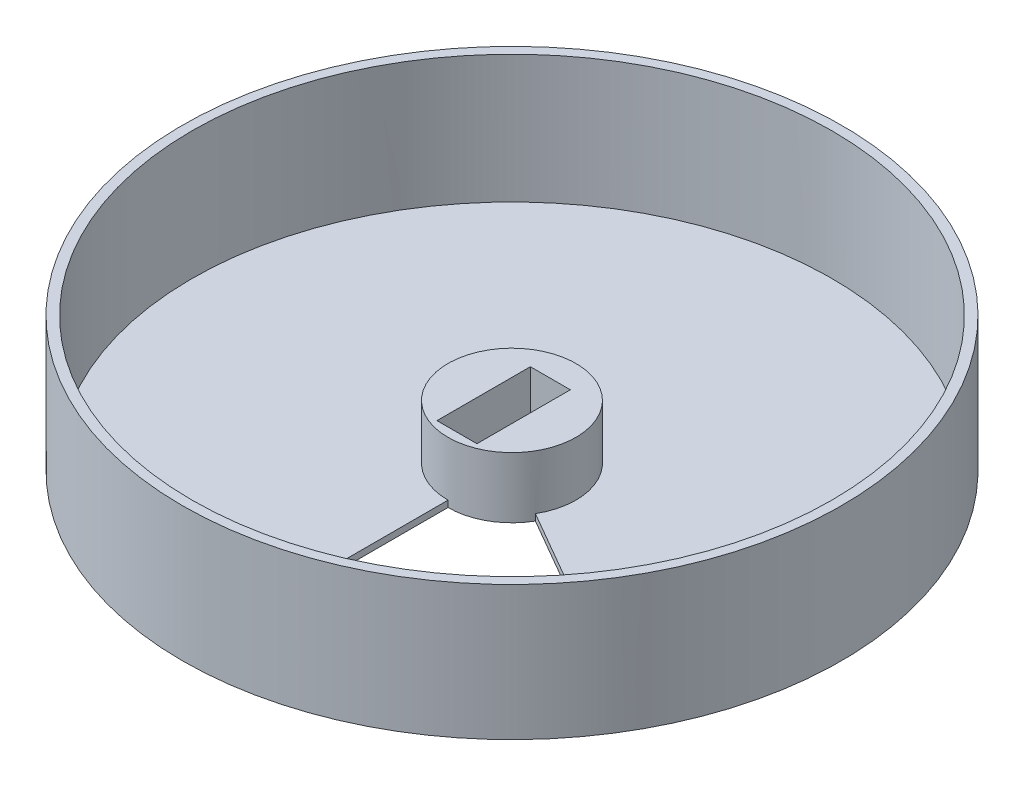
ISO-10303-21;
HEADER;
FILE_DESCRIPTION(('STEP AP214'),'2;1');
FILE_NAME('part.step','',(''),(''),'','','');
FILE_SCHEMA(('AUTOMOTIVE_DESIGN { 1 0 10303 214 1 1 1 1 }'));
ENDSEC;
DATA;
#1=APPLICATION_CONTEXT('core data for automotive mechanical design processes');
#2=APPLICATION_PROTOCOL_DEFINITION('international standard','automotive_design',2000,#1);
#3=PRODUCT_CONTEXT('',#1,'mechanical');
#4=PRODUCT('Part','Part','',(#3));
#5=PRODUCT_RELATED_PRODUCT_CATEGORY('part','',(#4));
#6=PRODUCT_DEFINITION_FORMATION('','',#4);
#7=PRODUCT_DEFINITION_CONTEXT('part definition',#1,'design');
#8=PRODUCT_DEFINITION('design','',#6,#7);
#9=PRODUCT_DEFINITION_SHAPE('','',#8);
#10=(LENGTH_UNIT() NAMED_UNIT(*) SI_UNIT(.MILLI.,.METRE.));
#11=(NAMED_UNIT(*) PLANE_ANGLE_UNIT() SI_UNIT($,.RADIAN.));
#12=(NAMED_UNIT(*) SI_UNIT($,.STERADIAN.) SOLID_ANGLE_UNIT());
#13=UNCERTAINTY_MEASURE_WITH_UNIT(LENGTH_MEASURE(1.E-05),#10,'distance_accuracy_value','');
#14=(GEOMETRIC_REPRESENTATION_CONTEXT(3) GLOBAL_UNCERTAINTY_ASSIGNED_CONTEXT((#13)) GLOBAL_UNIT_ASSIGNED_CONTEXT((#10,
#11,#12)) REPRESENTATION_CONTEXT('',''));
#15=CARTESIAN_POINT('',(0.,0.,0.));
#16=DIRECTION('',(0.,0.,1.));
#17=DIRECTION('',(1.,0.,0.));
#18=AXIS2_PLACEMENT_3D('',#15,#16,#17);
#19=CARTESIAN_POINT('',(6.25,0.,-17.2));
#20=DIRECTION('',(0.,-1.,0.));
#21=DIRECTION('',(0.,0.,-1.));
#22=AXIS2_PLACEMENT_3D('',#19,#20,#21);
#23=PLANE('',#22);
#24=DIRECTION('',(0.,0.,1.));
#25=VECTOR('',#24,1.);
#26=CARTESIAN_POINT('',(6.25,0.,0.));
#27=LINE('',#26,#25);
#28=CARTESIAN_POINT('',(6.25,0.,2.80000000000001));
#29=VERTEX_POINT('',#28);
#30=CARTESIAN_POINT('',(6.25,0.,82.8));
#31=VERTEX_POINT('',#30);
#32=EDGE_CURVE('E119',#29,#31,#27,.T.);
#33=ORIENTED_EDGE('',*,*,#32,.F.);
#34=CARTESIAN_POINT('',(6.25,0.,-17.2));
#35=DIRECTION('',(0.,1.,0.));
#36=DIRECTION('',(0.,0.,1.));
#37=AXIS2_PLACEMENT_3D('',#34,#35,#36);
#38=CIRCLE('',#37,20.);
#39=CARTESIAN_POINT('',(23.5705080756892,0.,-7.20000000000065));
#40=VERTEX_POINT('',#39);
#41=EDGE_CURVE('E131',#40,#29,#38,.T.);
#42=ORIENTED_EDGE('',*,*,#41,.F.);
#43=DIRECTION('',(0.866025403784439,0.,0.5));
#44=VECTOR('',#43,1.);
#45=CARTESIAN_POINT('',(9.01031847254655,0.,-15.606329386827));
#46=LINE('',#45,#44);
#47=CARTESIAN_POINT('',(92.8525403784443,0.,32.7999999999994));
#48=VERTEX_POINT('',#47);
#49=EDGE_CURVE('E127',#40,#48,#46,.T.);
#50=ORIENTED_EDGE('',*,*,#49,.T.);
#51=CARTESIAN_POINT('',(6.25,0.,-17.2));
#52=DIRECTION('',(0.,1.,0.));
#53=DIRECTION('',(0.,0.,1.));
#54=AXIS2_PLACEMENT_3D('',#51,#52,#53);
#55=CIRCLE('',#54,100.);
#56=EDGE_CURVE('E133',#48,#31,#55,.T.);
#57=ORIENTED_EDGE('',*,*,#56,.T.);
#58=EDGE_LOOP('',(#33,#42,#50,#57));
#59=FACE_BOUND('',#58,.T.);
#60=ADVANCED_FACE('F52',(#59),#23,.F.);
#61=CARTESIAN_POINT('',(12.5,17.,0.));
#62=DIRECTION('',(-1.,0.,0.));
#63=DIRECTION('',(0.,0.,1.));
#64=AXIS2_PLACEMENT_3D('',#61,#62,#63);
#65=PLANE('',#64);
#66=DIRECTION('',(0.,0.,-1.));
#67=VECTOR('',#66,1.);
#68=CARTESIAN_POINT('',(12.5,0.,0.));
#69=LINE('',#68,#67);
#70=CARTESIAN_POINT('',(12.5,0.,0.));
#71=VERTEX_POINT('',#70);
#72=CARTESIAN_POINT('',(12.5,0.,-29.2));
#73=VERTEX_POINT('',#72);
#74=EDGE_CURVE('E140',#71,#73,#69,.T.);
#75=ORIENTED_EDGE('',*,*,#74,.F.);
#76=DIRECTION('',(0.,-1.,0.));
#77=VECTOR('',#76,1.);
#78=CARTESIAN_POINT('',(12.5,17.,0.));
#79=LINE('',#78,#77);
#80=CARTESIAN_POINT('',(12.5,17.,0.));
#81=VERTEX_POINT('',#80);
#82=EDGE_CURVE('E166',#81,#71,#79,.T.);
#83=ORIENTED_EDGE('',*,*,#82,.F.);
#84=DIRECTION('',(0.,0.,-1.));
#85=VECTOR('',#84,1.);
#86=CARTESIAN_POINT('',(12.5,17.,0.));
#87=LINE('',#86,#85);
#88=CARTESIAN_POINT('',(12.5,17.,-29.2));
#89=VERTEX_POINT('',#88);
#90=EDGE_CURVE('E200',#81,#89,#87,.T.);
#91=ORIENTED_EDGE('',*,*,#90,.T.);
#92=DIRECTION('',(0.,-1.,0.));
#93=VECTOR('',#92,1.);
#94=CARTESIAN_POINT('',(12.5,17.,-29.2));
#95=LINE('',#94,#93);
#96=EDGE_CURVE('E155',#89,#73,#95,.T.);
#97=ORIENTED_EDGE('',*,*,#96,.T.);
#98=EDGE_LOOP('',(#75,#83,#91,#97));
#99=FACE_BOUND('',#98,.T.);
#100=ADVANCED_FACE('F54',(#99),#65,.T.);
#101=CARTESIAN_POINT('',(0.,17.,0.));
#102=DIRECTION('',(0.,0.,-1.));
#103=DIRECTION('',(-1.,0.,0.));
#104=AXIS2_PLACEMENT_3D('',#101,#102,#103);
#105=PLANE('',#104);
#106=DIRECTION('',(1.,0.,0.));
#107=VECTOR('',#106,1.);
#108=CARTESIAN_POINT('',(0.,0.,0.));
#109=LINE('',#108,#107);
#110=CARTESIAN_POINT('',(0.,0.,0.));
#111=VERTEX_POINT('',#110);
#112=EDGE_CURVE('E146',#111,#71,#109,.T.);
#113=ORIENTED_EDGE('',*,*,#112,.F.);
#114=DIRECTION('',(0.,-1.,0.));
#115=VECTOR('',#114,1.);
#116=CARTESIAN_POINT('',(0.,17.,0.));
#117=LINE('',#116,#115);
#118=CARTESIAN_POINT('',(0.,17.,0.));
#119=VERTEX_POINT('',#118);
#120=EDGE_CURVE('E163',#119,#111,#117,.T.);
#121=ORIENTED_EDGE('',*,*,#120,.F.);
#122=DIRECTION('',(1.,0.,0.));
#123=VECTOR('',#122,1.);
#124=CARTESIAN_POINT('',(0.,17.,0.));
#125=LINE('',#124,#123);
#126=EDGE_CURVE('E204',#119,#81,#125,.T.);
#127=ORIENTED_EDGE('',*,*,#126,.T.);
#128=ORIENTED_EDGE('',*,*,#82,.T.);
#129=EDGE_LOOP('',(#113,#121,#127,#128));
#130=FACE_BOUND('',#129,.T.);
#131=ADVANCED_FACE('F237',(#130),#105,.T.);
#132=CARTESIAN_POINT('',(0.,17.,0.));
#133=DIRECTION('',(-1.,0.,0.));
#134=DIRECTION('',(0.,0.,1.));
#135=AXIS2_PLACEMENT_3D('',#132,#133,#134);
#136=PLANE('',#135);
#137=DIRECTION('',(0.,0.,-1.));
#138=VECTOR('',#137,1.);
#139=CARTESIAN_POINT('',(0.,0.,0.));
#140=LINE('',#139,#138);
#141=CARTESIAN_POINT('',(0.,0.,-29.2));
#142=VERTEX_POINT('',#141);
#143=EDGE_CURVE('E219',#111,#142,#140,.T.);
#144=ORIENTED_EDGE('',*,*,#143,.T.);
#145=DIRECTION('',(0.,-1.,0.));
#146=VECTOR('',#145,1.);
#147=CARTESIAN_POINT('',(0.,17.,-29.2));
#148=LINE('',#147,#146);
#149=CARTESIAN_POINT('',(0.,17.,-29.2));
#150=VERTEX_POINT('',#149);
#151=EDGE_CURVE('E158',#150,#142,#148,.T.);
#152=ORIENTED_EDGE('',*,*,#151,.F.);
#153=DIRECTION('',(0.,0.,-1.));
#154=VECTOR('',#153,1.);
#155=CARTESIAN_POINT('',(0.,17.,0.));
#156=LINE('',#155,#154);
#157=EDGE_CURVE('E208',#119,#150,#156,.T.);
#158=ORIENTED_EDGE('',*,*,#157,.F.);
#159=ORIENTED_EDGE('',*,*,#120,.T.);
#160=EDGE_LOOP('',(#144,#152,#158,#159));
#161=FACE_BOUND('',#160,.T.);
#162=ADVANCED_FACE('F243',(#161),#136,.F.);
#163=CARTESIAN_POINT('',(0.,17.,-29.2));
#164=DIRECTION('',(0.,0.,-1.));
#165=DIRECTION('',(-1.,0.,0.));
#166=AXIS2_PLACEMENT_3D('',#163,#164,#165);
#167=PLANE('',#166);
#168=DIRECTION('',(1.,0.,0.));
#169=VECTOR('',#168,1.);
#170=CARTESIAN_POINT('',(0.,0.,-29.2));
#171=LINE('',#170,#169);
#172=EDGE_CURVE('E153',#142,#73,#171,.T.);
#173=ORIENTED_EDGE('',*,*,#172,.T.);
#174=ORIENTED_EDGE('',*,*,#96,.F.);
#175=DIRECTION('',(1.,0.,0.));
#176=VECTOR('',#175,1.);
#177=CARTESIAN_POINT('',(0.,17.,-29.2));
#178=LINE('',#177,#176);
#179=EDGE_CURVE('E211',#150,#89,#178,.T.);
#180=ORIENTED_EDGE('',*,*,#179,.F.);
#181=ORIENTED_EDGE('',*,*,#151,.T.);
#182=EDGE_LOOP('',(#173,#174,#180,#181));
#183=FACE_BOUND('',#182,.T.);
#184=ADVANCED_FACE('F229',(#183),#167,.F.);
#185=CARTESIAN_POINT('',(6.25,17.,-17.2));
#186=DIRECTION('',(0.,-1.,0.));
#187=DIRECTION('',(0.,0.,-1.));
#188=AXIS2_PLACEMENT_3D('',#185,#186,#187);
#189=CYLINDRICAL_SURFACE('',#188,20.);
#190=CARTESIAN_POINT('',(6.25,17.,-17.2));
#191=DIRECTION('',(0.,1.,0.));
#192=DIRECTION('',(0.,0.,1.));
#193=AXIS2_PLACEMENT_3D('',#190,#191,#192);
#194=CIRCLE('',#193,20.);
#195=CARTESIAN_POINT('',(6.25,17.,2.80000000000001));
#196=VERTEX_POINT('',#195);
#197=EDGE_CURVE('E159',#196,#196,#194,.T.);
#198=ORIENTED_EDGE('',*,*,#197,.F.);
#199=EDGE_LOOP('',(#198));
#200=FACE_BOUND('',#199,.T.);
#201=ORIENTED_EDGE('',*,*,#41,.T.);
#202=DIRECTION('',(0.,1.,0.));
#203=VECTOR('',#202,1.);
#204=CARTESIAN_POINT('',(6.25,-20.,2.80000000000001));
#205=LINE('',#204,#203);
#206=CARTESIAN_POINT('',(6.25,-2.,2.80000000000001));
#207=VERTEX_POINT('',#206);
#208=EDGE_CURVE('E116',#207,#29,#205,.T.);
#209=ORIENTED_EDGE('',*,*,#208,.F.);
#210=CARTESIAN_POINT('',(6.25,-2.,-17.2));
#211=DIRECTION('',(0.,-1.,0.));
#212=DIRECTION('',(0.,0.,-1.));
#213=AXIS2_PLACEMENT_3D('',#210,#211,#212);
#214=CIRCLE('',#213,20.);
#215=CARTESIAN_POINT('',(23.5705080756892,-2.,-7.20000000000065));
#216=VERTEX_POINT('',#215);
#217=EDGE_CURVE('E12',#207,#216,#214,.F.);
#218=ORIENTED_EDGE('',*,*,#217,.T.);
#219=DIRECTION('',(0.,1.,0.));
#220=VECTOR('',#219,1.);
#221=CARTESIAN_POINT('',(23.5705080756892,-20.,-7.20000000000065));
#222=LINE('',#221,#220);
#223=EDGE_CURVE('E138',#216,#40,#222,.T.);
#224=ORIENTED_EDGE('',*,*,#223,.T.);
#225=EDGE_LOOP('',(#201,#209,#218,#224));
#226=FACE_BOUND('',#225,.T.);
#227=ADVANCED_FACE('F136',(#200,#226),#189,.T.);
#228=CARTESIAN_POINT('',(0.,17.,0.));
#229=DIRECTION('',(0.,1.,0.));
#230=DIRECTION('',(0.,0.,1.));
#231=AXIS2_PLACEMENT_3D('',#228,#229,#230);
#232=PLANE('',#231);
#233=ORIENTED_EDGE('',*,*,#90,.F.);
#234=ORIENTED_EDGE('',*,*,#126,.F.);
#235=ORIENTED_EDGE('',*,*,#157,.T.);
#236=ORIENTED_EDGE('',*,*,#179,.T.);
#237=EDGE_LOOP('',(#233,#234,#235,#236));
#238=FACE_BOUND('',#237,.T.);
#239=ORIENTED_EDGE('',*,*,#197,.T.);
#240=EDGE_LOOP('',(#239));
#241=FACE_BOUND('',#240,.T.);
#242=ADVANCED_FACE('F241',(#238,#241),#232,.T.);
#243=ORIENTED_EDGE('',*,*,#112,.T.);
#244=ORIENTED_EDGE('',*,*,#74,.T.);
#245=ORIENTED_EDGE('',*,*,#172,.F.);
#246=ORIENTED_EDGE('',*,*,#143,.F.);
#247=EDGE_LOOP('',(#243,#244,#245,#246));
#248=FACE_BOUND('',#247,.T.);
#249=ADVANCED_FACE('F232',(#248),#23,.F.);
#250=CARTESIAN_POINT('',(6.25,40.,-17.2));
#251=DIRECTION('',(0.,1.,0.));
#252=DIRECTION('',(0.,0.,1.));
#253=AXIS2_PLACEMENT_3D('',#250,#251,#252);
#254=PLANE('',#253);
#255=CARTESIAN_POINT('',(6.25,40.,-17.2));
#256=DIRECTION('',(0.,1.,0.));
#257=DIRECTION('',(0.,0.,1.));
#258=AXIS2_PLACEMENT_3D('',#255,#256,#257);
#259=CIRCLE('',#258,103.);
#260=CARTESIAN_POINT('',(6.25,40.,85.8));
#261=VERTEX_POINT('',#260);
#262=EDGE_CURVE('E149',#261,#261,#259,.T.);
#263=ORIENTED_EDGE('',*,*,#262,.T.);
#264=EDGE_LOOP('',(#263));
#265=FACE_BOUND('',#264,.T.);
#266=CARTESIAN_POINT('',(6.25,40.,-17.2));
#267=DIRECTION('',(0.,1.,0.));
#268=DIRECTION('',(0.,0.,1.));
#269=AXIS2_PLACEMENT_3D('',#266,#267,#268);
#270=CIRCLE('',#269,100.);
#271=CARTESIAN_POINT('',(6.25,40.,82.8));
#272=VERTEX_POINT('',#271);
#273=EDGE_CURVE('E191',#272,#272,#270,.T.);
#274=ORIENTED_EDGE('',*,*,#273,.F.);
#275=EDGE_LOOP('',(#274));
#276=FACE_BOUND('',#275,.T.);
#277=ADVANCED_FACE('F261',(#265,#276),#254,.T.);
#278=CARTESIAN_POINT('',(6.25,40.,-17.2));
#279=DIRECTION('',(0.,-1.,0.));
#280=DIRECTION('',(0.,0.,-1.));
#281=AXIS2_PLACEMENT_3D('',#278,#279,#280);
#282=CYLINDRICAL_SURFACE('',#281,100.);
#283=ORIENTED_EDGE('',*,*,#273,.T.);
#284=EDGE_LOOP('',(#283));
#285=FACE_BOUND('',#284,.T.);
#286=ORIENTED_EDGE('',*,*,#56,.F.);
#287=DIRECTION('',(0.,1.,0.));
#288=VECTOR('',#287,1.);
#289=CARTESIAN_POINT('',(92.8525403784443,-20.,32.7999999999994));
#290=LINE('',#289,#288);
#291=CARTESIAN_POINT('',(92.8525403784443,-2.,32.7999999999994));
#292=VERTEX_POINT('',#291);
#293=EDGE_CURVE('E68',#292,#48,#290,.T.);
#294=ORIENTED_EDGE('',*,*,#293,.F.);
#295=CARTESIAN_POINT('',(6.25,-2.,-17.2));
#296=DIRECTION('',(0.,-1.,0.));
#297=DIRECTION('',(0.,0.,-1.));
#298=AXIS2_PLACEMENT_3D('',#295,#296,#297);
#299=CIRCLE('',#298,100.);
#300=CARTESIAN_POINT('',(6.25,-2.,82.8));
#301=VERTEX_POINT('',#300);
#302=EDGE_CURVE('E172',#292,#301,#299,.T.);
#303=ORIENTED_EDGE('',*,*,#302,.T.);
#304=DIRECTION('',(0.,1.,0.));
#305=VECTOR('',#304,1.);
#306=CARTESIAN_POINT('',(6.25,-20.,82.8));
#307=LINE('',#306,#305);
#308=EDGE_CURVE('E76',#301,#31,#307,.T.);
#309=ORIENTED_EDGE('',*,*,#308,.T.);
#310=EDGE_LOOP('',(#286,#294,#303,#309));
#311=FACE_BOUND('',#310,.T.);
#312=ADVANCED_FACE('F182',(#285,#311),#282,.F.);
#313=CARTESIAN_POINT('',(6.25,-2.,-17.2));
#314=DIRECTION('',(0.,-1.,0.));
#315=DIRECTION('',(0.,0.,-1.));
#316=AXIS2_PLACEMENT_3D('',#313,#314,#315);
#317=PLANE('',#316);
#318=ORIENTED_EDGE('',*,*,#217,.F.);
#319=DIRECTION('',(0.,0.,-1.));
#320=VECTOR('',#319,1.);
#321=CARTESIAN_POINT('',(6.25,-2.,-17.2));
#322=LINE('',#321,#320);
#323=EDGE_CURVE('E122',#301,#207,#322,.T.);
#324=ORIENTED_EDGE('',*,*,#323,.F.);
#325=ORIENTED_EDGE('',*,*,#302,.F.);
#326=DIRECTION('',(-0.866025403784439,0.,-0.5));
#327=VECTOR('',#326,1.);
#328=CARTESIAN_POINT('',(6.25000000000037,-2.,-17.2000000000007));
#329=LINE('',#328,#327);
#330=EDGE_CURVE('E61',#292,#216,#329,.T.);
#331=ORIENTED_EDGE('',*,*,#330,.T.);
#332=EDGE_LOOP('',(#318,#324,#325,#331));
#333=FACE_BOUND('',#332,.T.);
#334=CARTESIAN_POINT('',(6.25,-2.,-17.2));
#335=DIRECTION('',(0.,-1.,0.));
#336=DIRECTION('',(0.,0.,-1.));
#337=AXIS2_PLACEMENT_3D('',#334,#335,#336);
#338=CIRCLE('',#337,103.);
#339=CARTESIAN_POINT('',(6.25,-2.,-120.2));
#340=VERTEX_POINT('',#339);
#341=EDGE_CURVE('E141',#340,#340,#338,.T.);
#342=ORIENTED_EDGE('',*,*,#341,.T.);
#343=EDGE_LOOP('',(#342));
#344=FACE_BOUND('',#343,.T.);
#345=ADVANCED_FACE('F178',(#333,#344),#317,.T.);
#346=CARTESIAN_POINT('',(6.25,-2.,-17.2));
#347=DIRECTION('',(0.,1.,0.));
#348=DIRECTION('',(0.,0.,1.));
#349=AXIS2_PLACEMENT_3D('',#346,#347,#348);
#350=CYLINDRICAL_SURFACE('',#349,103.);
#351=ORIENTED_EDGE('',*,*,#341,.F.);
#352=EDGE_LOOP('',(#351));
#353=FACE_BOUND('',#352,.T.);
#354=ORIENTED_EDGE('',*,*,#262,.F.);
#355=EDGE_LOOP('',(#354));
#356=FACE_BOUND('',#355,.T.);
#357=ADVANCED_FACE('F273',(#353,#356),#350,.T.);
#358=CARTESIAN_POINT('',(9.01031847254655,-20.,-15.606329386827));
#359=DIRECTION('',(-0.5,0.,0.866025403784439));
#360=DIRECTION('',(0.866025403784439,0.,0.5));
#361=AXIS2_PLACEMENT_3D('',#358,#359,#360);
#362=PLANE('',#361);
#363=ORIENTED_EDGE('',*,*,#293,.T.);
#364=ORIENTED_EDGE('',*,*,#49,.F.);
#365=ORIENTED_EDGE('',*,*,#223,.F.);
#366=ORIENTED_EDGE('',*,*,#330,.F.);
#367=EDGE_LOOP('',(#363,#364,#365,#366));
#368=FACE_BOUND('',#367,.T.);
#369=ADVANCED_FACE('F180',(#368),#362,.T.);
#370=CARTESIAN_POINT('',(6.25,-20.,0.));
#371=DIRECTION('',(-1.,0.,0.));
#372=DIRECTION('',(0.,0.,1.));
#373=AXIS2_PLACEMENT_3D('',#370,#371,#372);
#374=PLANE('',#373);
#375=ORIENTED_EDGE('',*,*,#323,.T.);
#376=ORIENTED_EDGE('',*,*,#208,.T.);
#377=ORIENTED_EDGE('',*,*,#32,.T.);
#378=ORIENTED_EDGE('',*,*,#308,.F.);
#379=EDGE_LOOP('',(#375,#376,#377,#378));
#380=FACE_BOUND('',#379,.T.);
#381=ADVANCED_FACE('F118',(#380),#374,.F.);
#382=CLOSED_SHELL('',(#60,#100,#131,#162,#184,#227,#242,#249,#277,#312,#345,#357,#369,#381));
#383=MANIFOLD_SOLID_BREP('B2',#382);
#384=ADVANCED_BREP_SHAPE_REPRESENTATION('',(#18,#383),#14);
#385=SHAPE_DEFINITION_REPRESENTATION(#9,#384);
ENDSEC;
END-ISO-10303-21;
